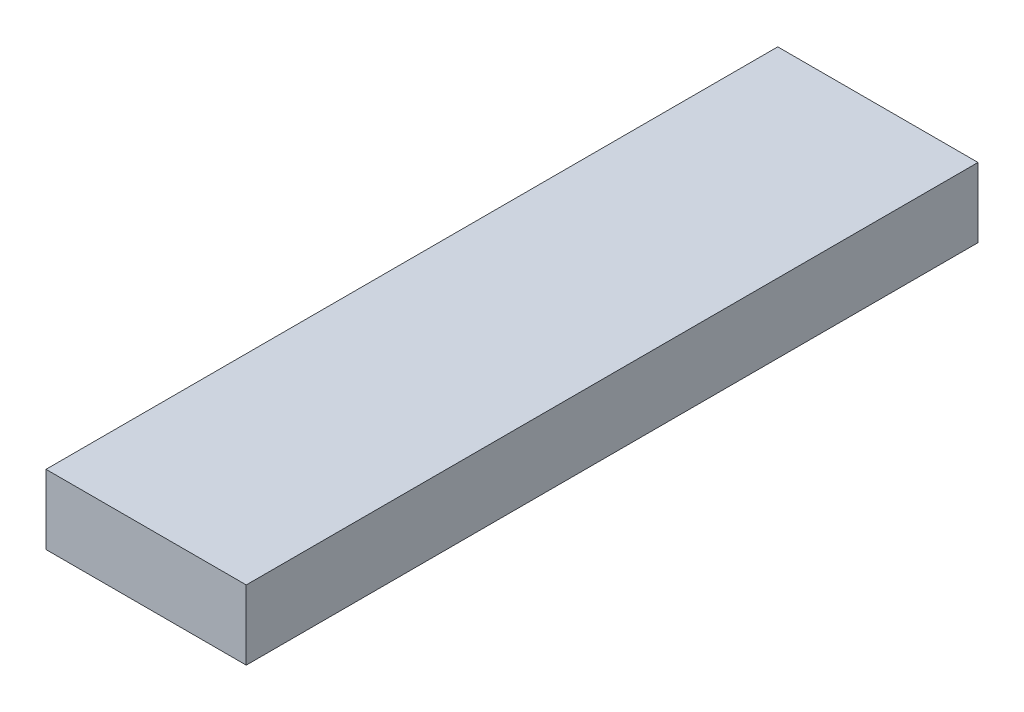
ISO-10303-21;
HEADER;
FILE_DESCRIPTION(('STEP AP214'),'2;1');
FILE_NAME('part.step','',(''),(''),'','','');
FILE_SCHEMA(('AUTOMOTIVE_DESIGN { 1 0 10303 214 1 1 1 1 }'));
ENDSEC;
DATA;
#1=APPLICATION_CONTEXT('core data for automotive mechanical design processes');
#2=APPLICATION_PROTOCOL_DEFINITION('international standard','automotive_design',2000,#1);
#3=PRODUCT_CONTEXT('',#1,'mechanical');
#4=PRODUCT('Part','Part','',(#3));
#5=PRODUCT_RELATED_PRODUCT_CATEGORY('part','',(#4));
#6=PRODUCT_DEFINITION_FORMATION('','',#4);
#7=PRODUCT_DEFINITION_CONTEXT('part definition',#1,'design');
#8=PRODUCT_DEFINITION('design','',#6,#7);
#9=PRODUCT_DEFINITION_SHAPE('','',#8);
#10=(LENGTH_UNIT() NAMED_UNIT(*) SI_UNIT(.MILLI.,.METRE.));
#11=(NAMED_UNIT(*) PLANE_ANGLE_UNIT() SI_UNIT($,.RADIAN.));
#12=(NAMED_UNIT(*) SI_UNIT($,.STERADIAN.) SOLID_ANGLE_UNIT());
#13=UNCERTAINTY_MEASURE_WITH_UNIT(LENGTH_MEASURE(1.E-05),#10,'distance_accuracy_value','');
#14=(GEOMETRIC_REPRESENTATION_CONTEXT(3) GLOBAL_UNCERTAINTY_ASSIGNED_CONTEXT((#13)) GLOBAL_UNIT_ASSIGNED_CONTEXT((#10,
#11,#12)) REPRESENTATION_CONTEXT('',''));
#15=CARTESIAN_POINT('',(0.,0.,0.));
#16=DIRECTION('',(0.,0.,1.));
#17=DIRECTION('',(1.,0.,0.));
#18=AXIS2_PLACEMENT_3D('',#15,#16,#17);
#19=CARTESIAN_POINT('',(27.44724,-9.525,200.59904));
#20=DIRECTION('',(-1.,0.,0.));
#21=DIRECTION('',(0.,0.,1.));
#22=AXIS2_PLACEMENT_3D('',#19,#20,#21);
#23=PLANE('',#22);
#24=DIRECTION('',(0.,1.,0.));
#25=VECTOR('',#24,1.);
#26=CARTESIAN_POINT('',(27.44724,-9.525,0.));
#27=LINE('',#26,#25);
#28=CARTESIAN_POINT('',(27.44724,-9.525,0.));
#29=VERTEX_POINT('',#28);
#30=CARTESIAN_POINT('',(27.44724,9.525,0.));
#31=VERTEX_POINT('',#30);
#32=EDGE_CURVE('E104',#29,#31,#27,.T.);
#33=ORIENTED_EDGE('',*,*,#32,.T.);
#34=DIRECTION('',(0.,0.,-1.));
#35=VECTOR('',#34,1.);
#36=CARTESIAN_POINT('',(27.44724,9.525,200.59904));
#37=LINE('',#36,#35);
#38=CARTESIAN_POINT('',(27.44724,9.525,200.59904));
#39=VERTEX_POINT('',#38);
#40=EDGE_CURVE('E11',#39,#31,#37,.T.);
#41=ORIENTED_EDGE('',*,*,#40,.F.);
#42=DIRECTION('',(0.,1.,0.));
#43=VECTOR('',#42,1.);
#44=CARTESIAN_POINT('',(27.44724,-9.525,200.59904));
#45=LINE('',#44,#43);
#46=CARTESIAN_POINT('',(27.44724,-9.525,200.59904));
#47=VERTEX_POINT('',#46);
#48=EDGE_CURVE('E92',#47,#39,#45,.T.);
#49=ORIENTED_EDGE('',*,*,#48,.F.);
#50=DIRECTION('',(0.,0.,-1.));
#51=VECTOR('',#50,1.);
#52=CARTESIAN_POINT('',(27.44724,-9.525,200.59904));
#53=LINE('',#52,#51);
#54=EDGE_CURVE('E100',#47,#29,#53,.T.);
#55=ORIENTED_EDGE('',*,*,#54,.T.);
#56=EDGE_LOOP('',(#33,#41,#49,#55));
#57=FACE_BOUND('',#56,.T.);
#58=ADVANCED_FACE('F41',(#57),#23,.F.);
#59=CARTESIAN_POINT('',(-27.44724,9.525,200.59904));
#60=DIRECTION('',(0.,-1.,0.));
#61=DIRECTION('',(0.,0.,-1.));
#62=AXIS2_PLACEMENT_3D('',#59,#60,#61);
#63=PLANE('',#62);
#64=DIRECTION('',(-1.,0.,0.));
#65=VECTOR('',#64,1.);
#66=CARTESIAN_POINT('',(-27.44724,9.525,0.));
#67=LINE('',#66,#65);
#68=CARTESIAN_POINT('',(-27.44724,9.525,0.));
#69=VERTEX_POINT('',#68);
#70=EDGE_CURVE('E96',#31,#69,#67,.T.);
#71=ORIENTED_EDGE('',*,*,#70,.T.);
#72=DIRECTION('',(0.,0.,-1.));
#73=VECTOR('',#72,1.);
#74=CARTESIAN_POINT('',(-27.44724,9.525,200.59904));
#75=LINE('',#74,#73);
#76=CARTESIAN_POINT('',(-27.44724,9.525,200.59904));
#77=VERTEX_POINT('',#76);
#78=EDGE_CURVE('E49',#77,#69,#75,.T.);
#79=ORIENTED_EDGE('',*,*,#78,.F.);
#80=DIRECTION('',(-1.,0.,0.));
#81=VECTOR('',#80,1.);
#82=CARTESIAN_POINT('',(-27.44724,9.525,200.59904));
#83=LINE('',#82,#81);
#84=EDGE_CURVE('E87',#39,#77,#83,.T.);
#85=ORIENTED_EDGE('',*,*,#84,.F.);
#86=ORIENTED_EDGE('',*,*,#40,.T.);
#87=EDGE_LOOP('',(#71,#79,#85,#86));
#88=FACE_BOUND('',#87,.T.);
#89=ADVANCED_FACE('F95',(#88),#63,.F.);
#90=CARTESIAN_POINT('',(-27.44724,-9.525,200.59904));
#91=DIRECTION('',(1.,0.,0.));
#92=DIRECTION('',(0.,0.,-1.));
#93=AXIS2_PLACEMENT_3D('',#90,#91,#92);
#94=PLANE('',#93);
#95=DIRECTION('',(0.,-1.,0.));
#96=VECTOR('',#95,1.);
#97=CARTESIAN_POINT('',(-27.44724,-9.525,0.));
#98=LINE('',#97,#96);
#99=CARTESIAN_POINT('',(-27.44724,-9.525,0.));
#100=VERTEX_POINT('',#99);
#101=EDGE_CURVE('E74',#69,#100,#98,.T.);
#102=ORIENTED_EDGE('',*,*,#101,.T.);
#103=DIRECTION('',(0.,0.,-1.));
#104=VECTOR('',#103,1.);
#105=CARTESIAN_POINT('',(-27.44724,-9.525,200.59904));
#106=LINE('',#105,#104);
#107=CARTESIAN_POINT('',(-27.44724,-9.525,200.59904));
#108=VERTEX_POINT('',#107);
#109=EDGE_CURVE('E97',#108,#100,#106,.T.);
#110=ORIENTED_EDGE('',*,*,#109,.F.);
#111=DIRECTION('',(0.,-1.,0.));
#112=VECTOR('',#111,1.);
#113=CARTESIAN_POINT('',(-27.44724,-9.525,200.59904));
#114=LINE('',#113,#112);
#115=EDGE_CURVE('E90',#77,#108,#114,.T.);
#116=ORIENTED_EDGE('',*,*,#115,.F.);
#117=ORIENTED_EDGE('',*,*,#78,.T.);
#118=EDGE_LOOP('',(#102,#110,#116,#117));
#119=FACE_BOUND('',#118,.T.);
#120=ADVANCED_FACE('F98',(#119),#94,.F.);
#121=CARTESIAN_POINT('',(-27.44724,-9.525,200.59904));
#122=DIRECTION('',(0.,1.,0.));
#123=DIRECTION('',(0.,0.,1.));
#124=AXIS2_PLACEMENT_3D('',#121,#122,#123);
#125=PLANE('',#124);
#126=DIRECTION('',(1.,0.,0.));
#127=VECTOR('',#126,1.);
#128=CARTESIAN_POINT('',(-27.44724,-9.525,0.));
#129=LINE('',#128,#127);
#130=EDGE_CURVE('E80',#100,#29,#129,.T.);
#131=ORIENTED_EDGE('',*,*,#130,.T.);
#132=ORIENTED_EDGE('',*,*,#54,.F.);
#133=DIRECTION('',(1.,0.,0.));
#134=VECTOR('',#133,1.);
#135=CARTESIAN_POINT('',(-27.44724,-9.525,200.59904));
#136=LINE('',#135,#134);
#137=EDGE_CURVE('E57',#108,#47,#136,.T.);
#138=ORIENTED_EDGE('',*,*,#137,.F.);
#139=ORIENTED_EDGE('',*,*,#109,.T.);
#140=EDGE_LOOP('',(#131,#132,#138,#139));
#141=FACE_BOUND('',#140,.T.);
#142=ADVANCED_FACE('F111',(#141),#125,.F.);
#143=CARTESIAN_POINT('',(0.,0.,200.59904));
#144=DIRECTION('',(0.,0.,-1.));
#145=DIRECTION('',(-1.,0.,0.));
#146=AXIS2_PLACEMENT_3D('',#143,#144,#145);
#147=PLANE('',#146);
#148=ORIENTED_EDGE('',*,*,#48,.T.);
#149=ORIENTED_EDGE('',*,*,#84,.T.);
#150=ORIENTED_EDGE('',*,*,#115,.T.);
#151=ORIENTED_EDGE('',*,*,#137,.T.);
#152=EDGE_LOOP('',(#148,#149,#150,#151));
#153=FACE_BOUND('',#152,.T.);
#154=ADVANCED_FACE('F88',(#153),#147,.F.);
#155=CARTESIAN_POINT('',(0.,0.,0.));
#156=DIRECTION('',(0.,0.,-1.));
#157=DIRECTION('',(-1.,0.,0.));
#158=AXIS2_PLACEMENT_3D('',#155,#156,#157);
#159=PLANE('',#158);
#160=ORIENTED_EDGE('',*,*,#32,.F.);
#161=ORIENTED_EDGE('',*,*,#130,.F.);
#162=ORIENTED_EDGE('',*,*,#101,.F.);
#163=ORIENTED_EDGE('',*,*,#70,.F.);
#164=EDGE_LOOP('',(#160,#161,#162,#163));
#165=FACE_BOUND('',#164,.T.);
#166=ADVANCED_FACE('F114',(#165),#159,.T.);
#167=CLOSED_SHELL('',(#58,#89,#120,#142,#154,#166));
#168=MANIFOLD_SOLID_BREP('B2',#167);
#169=ADVANCED_BREP_SHAPE_REPRESENTATION('',(#18,#168),#14);
#170=SHAPE_DEFINITION_REPRESENTATION(#9,#169);
ENDSEC;
END-ISO-10303-21;
